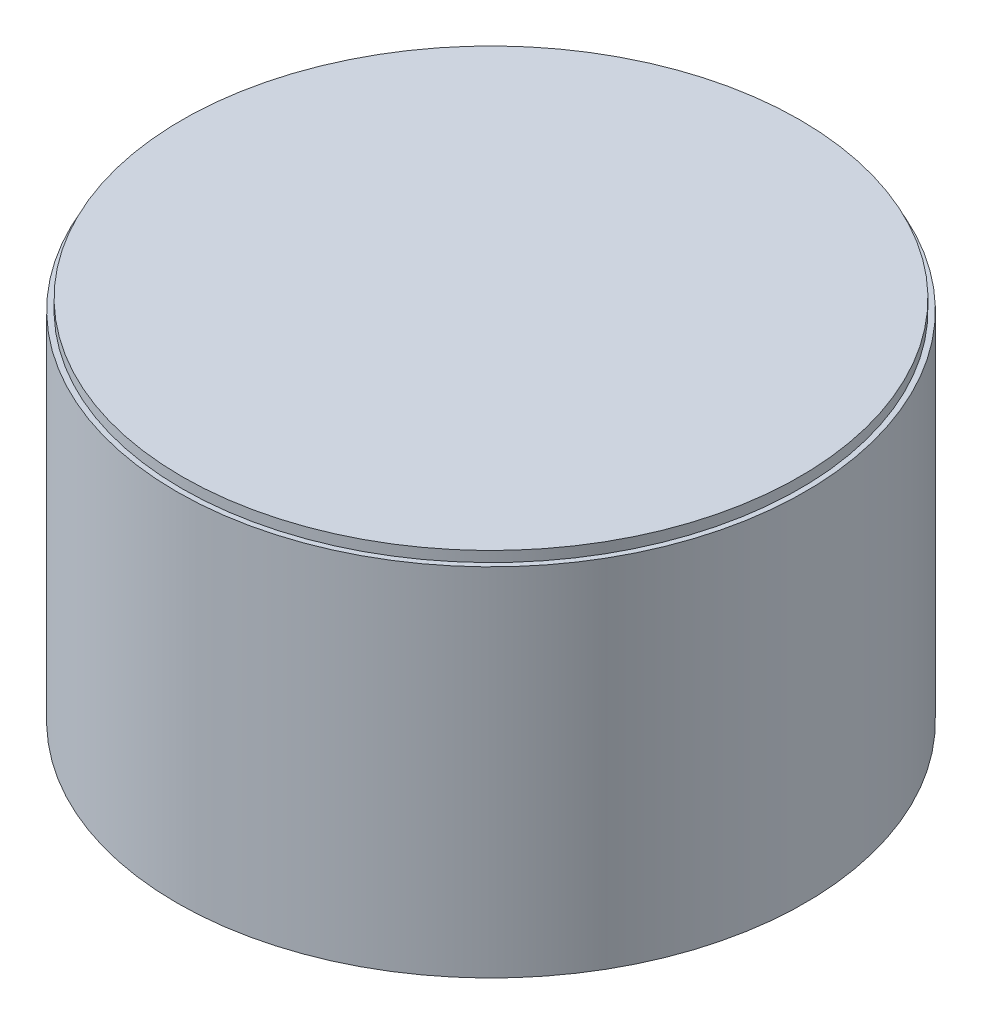
ISO-10303-21;
HEADER;
FILE_DESCRIPTION(('STEP AP214'),'2;1');
FILE_NAME('part.step','',(''),(''),'','','');
FILE_SCHEMA(('AUTOMOTIVE_DESIGN { 1 0 10303 214 1 1 1 1 }'));
ENDSEC;
DATA;
#1=APPLICATION_CONTEXT('core data for automotive mechanical design processes');
#2=APPLICATION_PROTOCOL_DEFINITION('international standard','automotive_design',2000,#1);
#3=PRODUCT_CONTEXT('',#1,'mechanical');
#4=PRODUCT('Part','Part','',(#3));
#5=PRODUCT_RELATED_PRODUCT_CATEGORY('part','',(#4));
#6=PRODUCT_DEFINITION_FORMATION('','',#4);
#7=PRODUCT_DEFINITION_CONTEXT('part definition',#1,'design');
#8=PRODUCT_DEFINITION('design','',#6,#7);
#9=PRODUCT_DEFINITION_SHAPE('','',#8);
#10=(LENGTH_UNIT() NAMED_UNIT(*) SI_UNIT(.MILLI.,.METRE.));
#11=(NAMED_UNIT(*) PLANE_ANGLE_UNIT() SI_UNIT($,.RADIAN.));
#12=(NAMED_UNIT(*) SI_UNIT($,.STERADIAN.) SOLID_ANGLE_UNIT());
#13=UNCERTAINTY_MEASURE_WITH_UNIT(LENGTH_MEASURE(1.E-05),#10,'distance_accuracy_value','');
#14=(GEOMETRIC_REPRESENTATION_CONTEXT(3) GLOBAL_UNCERTAINTY_ASSIGNED_CONTEXT((#13)) GLOBAL_UNIT_ASSIGNED_CONTEXT((#10,
#11,#12)) REPRESENTATION_CONTEXT('',''));
#15=CARTESIAN_POINT('',(0.,0.,0.));
#16=DIRECTION('',(0.,0.,1.));
#17=DIRECTION('',(1.,0.,0.));
#18=AXIS2_PLACEMENT_3D('',#15,#16,#17);
#19=CARTESIAN_POINT('',(0.,1.7,0.));
#20=DIRECTION('',(0.,-1.,0.));
#21=DIRECTION('',(0.,0.,-1.));
#22=AXIS2_PLACEMENT_3D('',#19,#20,#21);
#23=CYLINDRICAL_SURFACE('',#22,3.);
#24=CARTESIAN_POINT('',(0.,1.7,0.));
#25=DIRECTION('',(0.,1.,0.));
#26=DIRECTION('',(0.,0.,1.));
#27=AXIS2_PLACEMENT_3D('',#24,#25,#26);
#28=CIRCLE('',#27,3.);
#29=CARTESIAN_POINT('',(0.,1.7,3.));
#30=VERTEX_POINT('',#29);
#31=EDGE_CURVE('E55',#30,#30,#28,.T.);
#32=ORIENTED_EDGE('',*,*,#31,.F.);
#33=EDGE_LOOP('',(#32));
#34=FACE_BOUND('',#33,.T.);
#35=CARTESIAN_POINT('',(0.,-1.7,0.));
#36=DIRECTION('',(0.,1.,0.));
#37=DIRECTION('',(0.,0.,1.));
#38=AXIS2_PLACEMENT_3D('',#35,#36,#37);
#39=CIRCLE('',#38,3.);
#40=CARTESIAN_POINT('',(0.,-1.7,3.));
#41=VERTEX_POINT('',#40);
#42=EDGE_CURVE('E48',#41,#41,#39,.T.);
#43=ORIENTED_EDGE('',*,*,#42,.T.);
#44=EDGE_LOOP('',(#43));
#45=FACE_BOUND('',#44,.T.);
#46=ADVANCED_FACE('F44',(#34,#45),#23,.T.);
#47=CARTESIAN_POINT('',(0.,1.7,0.));
#48=DIRECTION('',(0.,1.,0.));
#49=DIRECTION('',(0.,0.,1.));
#50=AXIS2_PLACEMENT_3D('',#47,#48,#49);
#51=PLANE('',#50);
#52=CARTESIAN_POINT('',(0.,1.7,0.));
#53=DIRECTION('',(0.,1.,0.));
#54=DIRECTION('',(0.,0.,1.));
#55=AXIS2_PLACEMENT_3D('',#52,#53,#54);
#56=CIRCLE('',#55,2.95);
#57=CARTESIAN_POINT('',(0.,1.7,2.95));
#58=VERTEX_POINT('',#57);
#59=EDGE_CURVE('E10',#58,#58,#56,.T.);
#60=ORIENTED_EDGE('',*,*,#59,.F.);
#61=EDGE_LOOP('',(#60));
#62=FACE_BOUND('',#61,.T.);
#63=ORIENTED_EDGE('',*,*,#31,.T.);
#64=EDGE_LOOP('',(#63));
#65=FACE_BOUND('',#64,.T.);
#66=ADVANCED_FACE('F67',(#62,#65),#51,.T.);
#67=CARTESIAN_POINT('',(0.,-1.7,0.));
#68=DIRECTION('',(0.,1.,0.));
#69=DIRECTION('',(0.,0.,1.));
#70=AXIS2_PLACEMENT_3D('',#67,#68,#69);
#71=PLANE('',#70);
#72=ORIENTED_EDGE('',*,*,#42,.F.);
#73=EDGE_LOOP('',(#72));
#74=FACE_BOUND('',#73,.T.);
#75=ADVANCED_FACE('F66',(#74),#71,.F.);
#76=CARTESIAN_POINT('',(0.,1.8,0.));
#77=DIRECTION('',(0.,-1.,0.));
#78=DIRECTION('',(0.,0.,-1.));
#79=AXIS2_PLACEMENT_3D('',#76,#77,#78);
#80=CYLINDRICAL_SURFACE('',#79,2.95);
#81=CARTESIAN_POINT('',(0.,1.8,0.));
#82=DIRECTION('',(0.,1.,0.));
#83=DIRECTION('',(0.,0.,1.));
#84=AXIS2_PLACEMENT_3D('',#81,#82,#83);
#85=CIRCLE('',#84,2.95);
#86=CARTESIAN_POINT('',(0.,1.8,2.95));
#87=VERTEX_POINT('',#86);
#88=EDGE_CURVE('E59',#87,#87,#85,.T.);
#89=ORIENTED_EDGE('',*,*,#88,.F.);
#90=EDGE_LOOP('',(#89));
#91=FACE_BOUND('',#90,.T.);
#92=ORIENTED_EDGE('',*,*,#59,.T.);
#93=EDGE_LOOP('',(#92));
#94=FACE_BOUND('',#93,.T.);
#95=ADVANCED_FACE('F68',(#91,#94),#80,.T.);
#96=CARTESIAN_POINT('',(0.,1.8,0.));
#97=DIRECTION('',(0.,1.,0.));
#98=DIRECTION('',(0.,0.,1.));
#99=AXIS2_PLACEMENT_3D('',#96,#97,#98);
#100=PLANE('',#99);
#101=ORIENTED_EDGE('',*,*,#88,.T.);
#102=EDGE_LOOP('',(#101));
#103=FACE_BOUND('',#102,.T.);
#104=ADVANCED_FACE('F73',(#103),#100,.T.);
#105=CLOSED_SHELL('',(#46,#66,#75,#95,#104));
#106=MANIFOLD_SOLID_BREP('B2',#105);
#107=ADVANCED_BREP_SHAPE_REPRESENTATION('',(#18,#106),#14);
#108=SHAPE_DEFINITION_REPRESENTATION(#9,#107);
ENDSEC;
END-ISO-10303-21;
